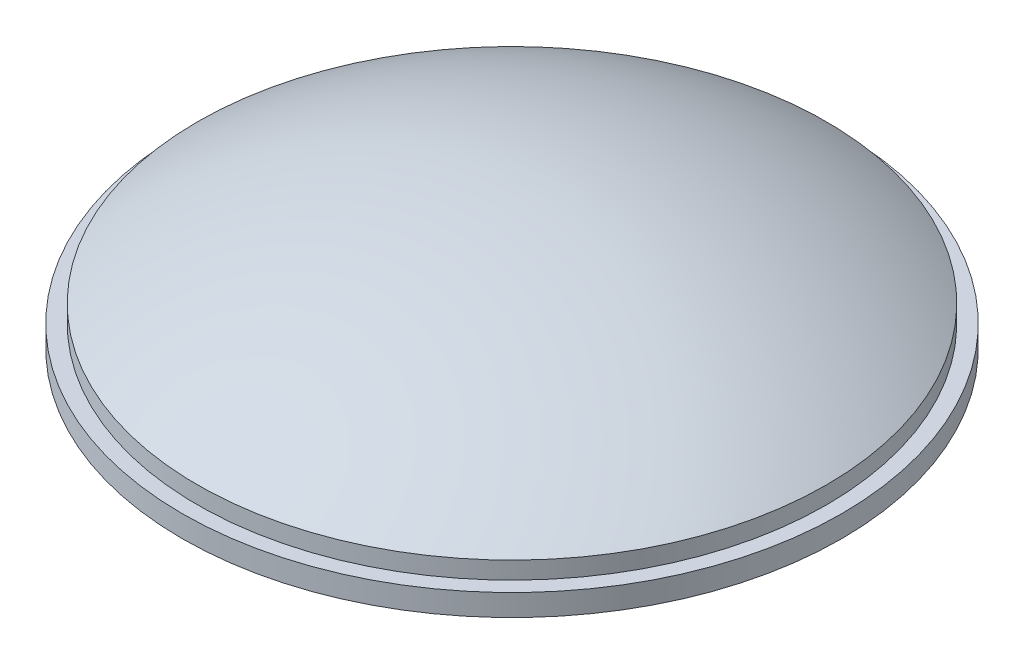
ISO-10303-21;
HEADER;
FILE_DESCRIPTION(('STEP AP214'),'2;1');
FILE_NAME('part.step','',(''),(''),'','','');
FILE_SCHEMA(('AUTOMOTIVE_DESIGN { 1 0 10303 214 1 1 1 1 }'));
ENDSEC;
DATA;
#1=APPLICATION_CONTEXT('core data for automotive mechanical design processes');
#2=APPLICATION_PROTOCOL_DEFINITION('international standard','automotive_design',2000,#1);
#3=PRODUCT_CONTEXT('',#1,'mechanical');
#4=PRODUCT('Part','Part','',(#3));
#5=PRODUCT_RELATED_PRODUCT_CATEGORY('part','',(#4));
#6=PRODUCT_DEFINITION_FORMATION('','',#4);
#7=PRODUCT_DEFINITION_CONTEXT('part definition',#1,'design');
#8=PRODUCT_DEFINITION('design','',#6,#7);
#9=PRODUCT_DEFINITION_SHAPE('','',#8);
#10=(LENGTH_UNIT() NAMED_UNIT(*) SI_UNIT(.MILLI.,.METRE.));
#11=(NAMED_UNIT(*) PLANE_ANGLE_UNIT() SI_UNIT($,.RADIAN.));
#12=(NAMED_UNIT(*) SI_UNIT($,.STERADIAN.) SOLID_ANGLE_UNIT());
#13=UNCERTAINTY_MEASURE_WITH_UNIT(LENGTH_MEASURE(1.E-05),#10,'distance_accuracy_value','');
#14=(GEOMETRIC_REPRESENTATION_CONTEXT(3) GLOBAL_UNCERTAINTY_ASSIGNED_CONTEXT((#13)) GLOBAL_UNIT_ASSIGNED_CONTEXT((#10,
#11,#12)) REPRESENTATION_CONTEXT('',''));
#15=CARTESIAN_POINT('',(0.,0.,0.));
#16=DIRECTION('',(0.,0.,1.));
#17=DIRECTION('',(1.,0.,0.));
#18=AXIS2_PLACEMENT_3D('',#15,#16,#17);
#19=CARTESIAN_POINT('',(0.,-67.2840090090088,0.));
#20=DIRECTION('',(0.,1.,0.));
#21=DIRECTION('',(1.,0.,0.));
#22=AXIS2_PLACEMENT_3D('',#19,#20,#21);
#23=SPHERICAL_SURFACE('',#22,129.484009009009);
#24=CARTESIAN_POINT('',(0.,40.,0.));
#25=DIRECTION('',(0.,1.,0.));
#26=DIRECTION('',(-1.,0.,0.));
#27=AXIS2_PLACEMENT_3D('',#24,#25,#26);
#28=CIRCLE('',#27,72.5);
#29=CARTESIAN_POINT('',(-72.5,40.,0.));
#30=VERTEX_POINT('',#29);
#31=EDGE_CURVE('E47',#30,#30,#28,.T.);
#32=ORIENTED_EDGE('',*,*,#31,.T.);
#33=EDGE_LOOP('',(#32));
#34=FACE_BOUND('',#33,.T.);
#35=ADVANCED_FACE('F35',(#34),#23,.T.);
#36=CARTESIAN_POINT('',(0.,0.,0.));
#37=DIRECTION('',(0.,1.,0.));
#38=DIRECTION('',(-1.,0.,0.));
#39=AXIS2_PLACEMENT_3D('',#36,#37,#38);
#40=CYLINDRICAL_SURFACE('',#39,72.5);
#41=ORIENTED_EDGE('',*,*,#31,.F.);
#42=EDGE_LOOP('',(#41));
#43=FACE_BOUND('',#42,.T.);
#44=CARTESIAN_POINT('',(0.,36.,0.));
#45=DIRECTION('',(0.,1.,0.));
#46=DIRECTION('',(-1.,0.,0.));
#47=AXIS2_PLACEMENT_3D('',#44,#45,#46);
#48=CIRCLE('',#47,72.5);
#49=CARTESIAN_POINT('',(-72.5,36.,0.));
#50=VERTEX_POINT('',#49);
#51=EDGE_CURVE('E82',#50,#50,#48,.T.);
#52=ORIENTED_EDGE('',*,*,#51,.T.);
#53=EDGE_LOOP('',(#52));
#54=FACE_BOUND('',#53,.T.);
#55=ADVANCED_FACE('F88',(#43,#54),#40,.T.);
#56=CARTESIAN_POINT('',(72.5,36.,0.));
#57=DIRECTION('',(0.,-1.,0.));
#58=DIRECTION('',(1.,0.,0.));
#59=AXIS2_PLACEMENT_3D('',#56,#57,#58);
#60=PLANE('',#59);
#61=ORIENTED_EDGE('',*,*,#51,.F.);
#62=EDGE_LOOP('',(#61));
#63=FACE_BOUND('',#62,.T.);
#64=CARTESIAN_POINT('',(0.,36.,0.));
#65=DIRECTION('',(0.,1.,0.));
#66=DIRECTION('',(-1.,0.,0.));
#67=AXIS2_PLACEMENT_3D('',#64,#65,#66);
#68=CIRCLE('',#67,76.);
#69=CARTESIAN_POINT('',(-76.,36.,0.));
#70=VERTEX_POINT('',#69);
#71=EDGE_CURVE('E79',#70,#70,#68,.T.);
#72=ORIENTED_EDGE('',*,*,#71,.T.);
#73=EDGE_LOOP('',(#72));
#74=FACE_BOUND('',#73,.T.);
#75=ADVANCED_FACE('F91',(#63,#74),#60,.F.);
#76=CARTESIAN_POINT('',(0.,0.,0.));
#77=DIRECTION('',(0.,1.,0.));
#78=DIRECTION('',(-1.,0.,0.));
#79=AXIS2_PLACEMENT_3D('',#76,#77,#78);
#80=CYLINDRICAL_SURFACE('',#79,76.);
#81=ORIENTED_EDGE('',*,*,#71,.F.);
#82=EDGE_LOOP('',(#81));
#83=FACE_BOUND('',#82,.T.);
#84=CARTESIAN_POINT('',(0.,31.,0.));
#85=DIRECTION('',(0.,1.,0.));
#86=DIRECTION('',(-1.,0.,0.));
#87=AXIS2_PLACEMENT_3D('',#84,#85,#86);
#88=CIRCLE('',#87,76.);
#89=CARTESIAN_POINT('',(-76.,31.,0.));
#90=VERTEX_POINT('',#89);
#91=EDGE_CURVE('E76',#90,#90,#88,.T.);
#92=ORIENTED_EDGE('',*,*,#91,.T.);
#93=EDGE_LOOP('',(#92));
#94=FACE_BOUND('',#93,.T.);
#95=ADVANCED_FACE('F96',(#83,#94),#80,.T.);
#96=CARTESIAN_POINT('',(76.,31.,0.));
#97=DIRECTION('',(0.,1.,0.));
#98=DIRECTION('',(-1.,0.,0.));
#99=AXIS2_PLACEMENT_3D('',#96,#97,#98);
#100=PLANE('',#99);
#101=ORIENTED_EDGE('',*,*,#91,.F.);
#102=EDGE_LOOP('',(#101));
#103=FACE_BOUND('',#102,.T.);
#104=CARTESIAN_POINT('',(0.,31.,0.));
#105=DIRECTION('',(0.,1.,0.));
#106=DIRECTION('',(-1.,0.,0.));
#107=AXIS2_PLACEMENT_3D('',#104,#105,#106);
#108=CIRCLE('',#107,73.);
#109=CARTESIAN_POINT('',(-73.,31.,0.));
#110=VERTEX_POINT('',#109);
#111=EDGE_CURVE('E69',#110,#110,#108,.T.);
#112=ORIENTED_EDGE('',*,*,#111,.T.);
#113=EDGE_LOOP('',(#112));
#114=FACE_BOUND('',#113,.T.);
#115=ADVANCED_FACE('F102',(#103,#114),#100,.F.);
#116=CARTESIAN_POINT('',(0.,25.,0.));
#117=DIRECTION('',(0.,1.,0.));
#118=DIRECTION('',(-1.,0.,0.));
#119=AXIS2_PLACEMENT_3D('',#116,#117,#118);
#120=CONICAL_SURFACE('',#119,67.,0.785398163397447);
#121=ORIENTED_EDGE('',*,*,#111,.F.);
#122=EDGE_LOOP('',(#121));
#123=FACE_BOUND('',#122,.T.);
#124=CARTESIAN_POINT('',(0.,25.,0.));
#125=DIRECTION('',(0.,1.,0.));
#126=DIRECTION('',(-1.,0.,0.));
#127=AXIS2_PLACEMENT_3D('',#124,#125,#126);
#128=CIRCLE('',#127,67.);
#129=CARTESIAN_POINT('',(-67.,25.,0.));
#130=VERTEX_POINT('',#129);
#131=EDGE_CURVE('E66',#130,#130,#128,.T.);
#132=ORIENTED_EDGE('',*,*,#131,.T.);
#133=EDGE_LOOP('',(#132));
#134=FACE_BOUND('',#133,.T.);
#135=ADVANCED_FACE('F108',(#123,#134),#120,.T.);
#136=CARTESIAN_POINT('',(67.,25.,0.));
#137=DIRECTION('',(0.,1.,0.));
#138=DIRECTION('',(-1.,0.,0.));
#139=AXIS2_PLACEMENT_3D('',#136,#137,#138);
#140=PLANE('',#139);
#141=DIRECTION('',(0.,0.,-1.));
#142=VECTOR('',#141,1.);
#143=CARTESIAN_POINT('',(30.,25.,-90.));
#144=LINE('',#143,#142);
#145=CARTESIAN_POINT('',(30.,25.,41.2431812546026));
#146=VERTEX_POINT('',#145);
#147=CARTESIAN_POINT('',(30.,25.,-41.2431812546026));
#148=VERTEX_POINT('',#147);
#149=EDGE_CURVE('E53',#146,#148,#144,.T.);
#150=ORIENTED_EDGE('',*,*,#149,.T.);
#151=CARTESIAN_POINT('',(0.,25.,0.));
#152=DIRECTION('',(0.,1.,0.));
#153=DIRECTION('',(-1.,0.,0.));
#154=AXIS2_PLACEMENT_3D('',#151,#152,#153);
#155=CIRCLE('',#154,51.);
#156=EDGE_CURVE('E61',#148,#146,#155,.T.);
#157=ORIENTED_EDGE('',*,*,#156,.T.);
#158=EDGE_LOOP('',(#150,#157));
#159=FACE_BOUND('',#158,.T.);
#160=ORIENTED_EDGE('',*,*,#131,.F.);
#161=EDGE_LOOP('',(#160));
#162=FACE_BOUND('',#161,.T.);
#163=ADVANCED_FACE('F59',(#159,#162),#140,.F.);
#164=CARTESIAN_POINT('',(0.,0.,0.));
#165=DIRECTION('',(0.,1.,0.));
#166=DIRECTION('',(-1.,0.,0.));
#167=AXIS2_PLACEMENT_3D('',#164,#165,#166);
#168=CONICAL_SURFACE('',#167,26.0000000000001,0.785398163397446);
#169=ORIENTED_EDGE('',*,*,#156,.F.);
#170=CARTESIAN_POINT('',(30.,63.2561842555022,-84.0634666656815));
#171=CARTESIAN_POINT('',(30.,62.4253662944433,-83.1813231893325));
#172=CARTESIAN_POINT('',(30.,61.5953262020832,-82.2984470804804));
#173=CARTESIAN_POINT('',(30.,59.9369637629694,-80.5310823683127));
#174=CARTESIAN_POINT('',(30.,59.1086414170306,-79.6465937642325));
#175=CARTESIAN_POINT('',(30.,56.6264584983327,-76.9904503549921));
#176=CARTESIAN_POINT('',(30.,54.975418905701,-75.2161570626856));
#177=CARTESIAN_POINT('',(30.,51.6809414756593,-71.6573963460739));
#178=CARTESIAN_POINT('',(30.,50.0375123205133,-69.8729208763314));
#179=CARTESIAN_POINT('',(30.,47.5809205263487,-67.1884035107763));
#180=CARTESIAN_POINT('',(30.,46.7634867778871,-66.2922690744976));
#181=CARTESIAN_POINT('',(30.,45.1318082494673,-64.4970880269588));
#182=CARTESIAN_POINT('',(30.,44.3175634939864,-63.5980413934424));
#183=CARTESIAN_POINT('',(30.,42.6752942444332,-61.7774529071672));
#184=CARTESIAN_POINT('',(30.,41.8473473240518,-60.8558410569404));
#185=CARTESIAN_POINT('',(30.,40.1956969358118,-59.0088231041535));
#186=CARTESIAN_POINT('',(30.,39.3719934633595,-58.0834170057026));
#187=CARTESIAN_POINT('',(30.,37.7294248741186,-56.228333120142));
#188=CARTESIAN_POINT('',(30.,36.9105597155701,-55.2986553700247));
#189=CARTESIAN_POINT('',(30.,35.2783662696471,-53.434455214387));
#190=CARTESIAN_POINT('',(30.,34.4650379630279,-52.4999328257252));
#191=CARTESIAN_POINT('',(30.,32.8451055225429,-50.6257688133558));
#192=CARTESIAN_POINT('',(30.,32.0384986765545,-49.6861295353528));
#193=CARTESIAN_POINT('',(30.,30.4326818474902,-47.800542223249));
#194=CARTESIAN_POINT('',(30.,29.6334718844283,-46.8545941720901));
#195=CARTESIAN_POINT('',(30.,28.0437461807804,-44.9554933048257));
#196=CARTESIAN_POINT('',(30.,27.2532300140013,-44.0023408457994));
#197=CARTESIAN_POINT('',(30.,25.6824121596366,-42.0876643719704));
#198=CARTESIAN_POINT('',(30.,24.9021103459941,-41.1261404607251));
#199=CARTESIAN_POINT('',(30.,23.4403916543385,-39.3016030462632));
#200=CARTESIAN_POINT('',(30.,22.7576893848367,-38.4396202204148));
#201=CARTESIAN_POINT('',(30.,21.4035675161649,-36.7068190085001));
#202=CARTESIAN_POINT('',(30.,20.7321479620497,-35.8360005871733));
#203=CARTESIAN_POINT('',(30.,19.4024250217844,-34.0838073290471));
#204=CARTESIAN_POINT('',(30.,18.7441273174398,-33.2024281729909));
#205=CARTESIAN_POINT('',(30.,17.4436066745168,-31.4278776180563));
#206=CARTESIAN_POINT('',(30.,16.8013835624419,-30.5347063466119));
#207=CARTESIAN_POINT('',(30.,15.5384121728091,-28.7375565434823));
#208=CARTESIAN_POINT('',(30.,14.9176015216905,-27.8336219606618));
#209=CARTESIAN_POINT('',(30.,13.699535442564,-26.0098806403375));
#210=CARTESIAN_POINT('',(30.,13.1022814352392,-25.090072950333));
#211=CARTESIAN_POINT('',(30.,11.9372828893454,-23.232742276029));
#212=CARTESIAN_POINT('',(30.,11.3695190444053,-22.2952314440102));
#213=CARTESIAN_POINT('',(30.,10.2702550833446,-20.3992217502899));
#214=CARTESIAN_POINT('',(30.,9.73874847316151,-19.4407266879305));
#215=CARTESIAN_POINT('',(30.,8.98497271763045,-18.0029525843828));
#216=CARTESIAN_POINT('',(30.,8.74522330985191,-17.5328157701222));
#217=CARTESIAN_POINT('',(30.,8.2775420175087,-16.586711387152));
#218=CARTESIAN_POINT('',(30.,8.04960995522943,-16.1107439062599));
#219=CARTESIAN_POINT('',(30.,7.38550812961494,-14.6736081512883));
#220=CARTESIAN_POINT('',(30.,6.96903012965642,-13.703201668415));
#221=CARTESIAN_POINT('',(30.,6.20206946369811,-11.738343673811));
#222=CARTESIAN_POINT('',(30.,5.85146374721712,-10.7439409905584));
#223=CARTESIAN_POINT('',(30.,5.385314399514,-9.234024830697));
#224=CARTESIAN_POINT('',(30.,5.23988902149167,-8.72765790341996));
#225=CARTESIAN_POINT('',(30.,4.97080370192731,-7.70919973912899));
#226=CARTESIAN_POINT('',(30.,4.84714064580353,-7.19710933242343));
#227=CARTESIAN_POINT('',(30.,4.64151115068319,-6.25134533046255));
#228=CARTESIAN_POINT('',(30.,4.55603480673082,-5.81843315536391));
#229=CARTESIAN_POINT('',(30.,4.40255507614627,-4.94956018228016));
#230=CARTESIAN_POINT('',(30.,4.33454959692239,-4.51359975583407));
#231=CARTESIAN_POINT('',(30.,4.2168240726839,-3.63924350859239));
#232=CARTESIAN_POINT('',(30.,4.1671026242438,-3.20084787733873));
#233=CARTESIAN_POINT('',(30.,4.08657207646532,-2.32231380224259));
#234=CARTESIAN_POINT('',(30.,4.05576307281358,-1.88217534959373));
#235=CARTESIAN_POINT('',(30.,4.01351700861687,-1.00199013985662));
#236=CARTESIAN_POINT('',(30.,4.00203515972078,-0.561945540179196));
#237=CARTESIAN_POINT('',(30.,3.99845986422236,0.318217991001513));
#238=CARTESIAN_POINT('',(30.,4.00636622370707,0.758336921717343));
#239=CARTESIAN_POINT('',(30.,4.04146244378115,1.63785332225908));
#240=CARTESIAN_POINT('',(30.,4.06865446789292,2.07725070559592));
#241=CARTESIAN_POINT('',(30.,4.14196104661393,2.95447073337908));
#242=CARTESIAN_POINT('',(30.,4.18807639933009,3.39229331062091));
#243=CARTESIAN_POINT('',(30.,4.31122289495557,4.36495416348759));
#244=CARTESIAN_POINT('',(30.,4.39290019204345,4.89920788161711));
#245=CARTESIAN_POINT('',(30.,4.58241236252349,5.96305436617669));
#246=CARTESIAN_POINT('',(30.,4.69024885153248,6.49264684262966));
#247=CARTESIAN_POINT('',(30.,4.93031982808335,7.54638747010486));
#248=CARTESIAN_POINT('',(30.,5.06256037056842,8.07053423581354));
#249=CARTESIAN_POINT('',(30.,5.34947354261337,9.1126545598085));
#250=CARTESIAN_POINT('',(30.,5.50414739193951,9.63062778076227));
#251=CARTESIAN_POINT('',(30.,5.83493495987267,10.6631979474077));
#252=CARTESIAN_POINT('',(30.,6.01117558636112,11.1777540862603));
#253=CARTESIAN_POINT('',(30.,6.38232301215375,12.2000700588485));
#254=CARTESIAN_POINT('',(30.,6.57722997394899,12.7078298333775));
#255=CARTESIAN_POINT('',(30.,6.98374686389606,13.7164333337717));
#256=CARTESIAN_POINT('',(30.,7.19535205165672,14.2172789753617));
#257=CARTESIAN_POINT('',(30.,7.63354587209392,15.2123251290182));
#258=CARTESIAN_POINT('',(30.,7.86013402046011,15.7065258552547));
#259=CARTESIAN_POINT('',(30.,8.55201069308329,17.1628597330158));
#260=CARTESIAN_POINT('',(30.,9.03646911208396,18.1159163015423));
#261=CARTESIAN_POINT('',(30.,10.04672966342,19.9999747173323));
#262=CARTESIAN_POINT('',(30.,10.5725437935651,20.930970061664));
#263=CARTESIAN_POINT('',(30.,11.6578876564405,22.7743723311027));
#264=CARTESIAN_POINT('',(30.,12.2174532827932,23.6867580353083));
#265=CARTESIAN_POINT('',(30.,13.3633595946569,25.4943615816247));
#266=CARTESIAN_POINT('',(30.,13.9496977998924,26.3895810031937));
#267=CARTESIAN_POINT('',(30.,15.1466366478178,28.1687865192262));
#268=CARTESIAN_POINT('',(30.,15.7573245919997,29.0527137011548));
#269=CARTESIAN_POINT('',(30.,16.9968651904574,30.8077297125316));
#270=CARTESIAN_POINT('',(30.,17.6257181847127,31.6788183012297));
#271=CARTESIAN_POINT('',(30.,18.8981545159248,33.409399053344));
#272=CARTESIAN_POINT('',(30.,19.5417294465792,34.268897410122));
#273=CARTESIAN_POINT('',(30.,20.8415124567003,35.9782618531779));
#274=CARTESIAN_POINT('',(30.,21.4977204397039,36.8281280129264));
#275=CARTESIAN_POINT('',(30.,22.8314578845211,38.5330733227064));
#276=CARTESIAN_POINT('',(30.,23.5091605195286,39.3880168294231));
#277=CARTESIAN_POINT('',(30.,24.8739574594678,41.0903676920497));
#278=CARTESIAN_POINT('',(30.,25.5610517771835,41.9377750376989));
#279=CARTESIAN_POINT('',(30.,26.9433660881821,43.6260803788503));
#280=CARTESIAN_POINT('',(30.,27.6385869360934,44.4669776739789));
#281=CARTESIAN_POINT('',(30.,29.0359867457392,46.1429719172708));
#282=CARTESIAN_POINT('',(30.,29.7381657348963,46.9780688425523));
#283=CARTESIAN_POINT('',(30.,31.1467335825323,48.6409695095796));
#284=CARTESIAN_POINT('',(30.,31.8531067144065,49.468786581169));
#285=CARTESIAN_POINT('',(30.,33.2711158814724,51.1198982630518));
#286=CARTESIAN_POINT('',(30.,33.982751916298,51.9431928736599));
#287=CARTESIAN_POINT('',(30.,35.4106190416706,53.5857155493524));
#288=CARTESIAN_POINT('',(30.,36.1268499063856,54.4049438108368));
#289=CARTESIAN_POINT('',(30.,37.5634079962696,56.0397977192166));
#290=CARTESIAN_POINT('',(30.,38.2837352183895,56.8554233687927));
#291=CARTESIAN_POINT('',(30.,40.4439632638287,59.2904806257557));
#292=CARTESIAN_POINT('',(30.,41.8892487636336,60.905137088485));
#293=CARTESIAN_POINT('',(30.,44.7913345091569,64.1240762053625));
#294=CARTESIAN_POINT('',(30.,46.2481348482179,65.7283587752248));
#295=CARTESIAN_POINT('',(30.,49.1711475239336,68.928407913698));
#296=CARTESIAN_POINT('',(30.,50.6373601352535,70.5241742312795));
#297=CARTESIAN_POINT('',(30.,53.5775040392454,73.7085675060198));
#298=CARTESIAN_POINT('',(30.,55.0514353107898,75.2971944826984));
#299=CARTESIAN_POINT('',(30.,58.0059167066772,78.4686321986462));
#300=CARTESIAN_POINT('',(30.,59.4864675978941,80.051442223185));
#301=CARTESIAN_POINT('',(30.,62.4530025353775,83.2119623420858));
#302=CARTESIAN_POINT('',(30.,63.9389865847638,84.7896724335184));
#303=CARTESIAN_POINT('',(30.,66.9155514391016,87.9407014904706));
#304=CARTESIAN_POINT('',(30.,68.4061321702108,89.5140205257637));
#305=CARTESIAN_POINT('',(30.,71.3912623603236,92.6568897445123));
#306=CARTESIAN_POINT('',(30.,72.8858118218337,94.2264399255862));
#307=CARTESIAN_POINT('',(30.,77.3789638458133,98.93479622311));
#308=CARTESIAN_POINT('',(30.,80.382707562857,102.068696592502));
#309=CARTESIAN_POINT('',(30.,86.4006049344509,108.3264978091));
#310=CARTESIAN_POINT('',(30.,89.4147586238402,111.450398622773));
#311=CARTESIAN_POINT('',(30.,95.4509928042615,117.690135110644));
#312=CARTESIAN_POINT('',(30.,98.4730727646375,120.805971298343));
#313=CARTESIAN_POINT('',(30.,104.523683211303,127.031365594737));
#314=CARTESIAN_POINT('',(30.,107.552213690585,130.140923710244));
#315=CARTESIAN_POINT('',(30.,113.332864887173,136.066270460748));
#316=CARTESIAN_POINT('',(30.,116.084523293172,138.882510227269));
#317=CARTESIAN_POINT('',(30.,121.591425434126,144.511482777275));
#318=CARTESIAN_POINT('',(30.,124.346669169764,147.324215560093));
#319=CARTESIAN_POINT('',(30.,129.860233013358,152.946773622857));
#320=CARTESIAN_POINT('',(30.,132.618553181367,155.756598843907));
#321=CARTESIAN_POINT('',(30.,138.137764929051,161.373722759363));
#322=CARTESIAN_POINT('',(30.,140.898656508865,164.181021453634));
#323=CARTESIAN_POINT('',(30.,146.417806004604,169.788530651883));
#324=CARTESIAN_POINT('',(30.,149.176060058951,172.588744956892));
#325=CARTESIAN_POINT('',(30.,154.694469235742,178.187299864422));
#326=CARTESIAN_POINT('',(30.,157.454624358276,180.985640466854));
#327=CARTESIAN_POINT('',(30.,162.976525618381,186.580627671909));
#328=CARTESIAN_POINT('',(30.,165.738271718942,189.377274311061));
#329=CARTESIAN_POINT('',(30.,171.263217720436,194.969130363231));
#330=CARTESIAN_POINT('',(30.,174.026417621142,197.764339776471));
#331=CARTESIAN_POINT('',(30.,176.790245367732,200.558928039379));
#332=B_SPLINE_CURVE_WITH_KNOTS('',3,(#170,#171,#172,#173,#174,#175,#176,#177,#178,#179,#180,
#181,#182,#183,#184,#185,#186,#187,#188,#189,#190,#191,#192,#193,#194,#195,#196,#197,#198,#199,
#200,#201,#202,#203,#204,#205,#206,#207,#208,#209,#210,#211,#212,#213,#214,#215,#216,#217,#218,
#219,#220,#221,#222,#223,#224,#225,#226,#227,#228,#229,#230,#231,#232,#233,#234,#235,#236,#237,
#238,#239,#240,#241,#242,#243,#244,#245,#246,#247,#248,#249,#250,#251,#252,#253,#254,#255,#256,
#257,#258,#259,#260,#261,#262,#263,#264,#265,#266,#267,#268,#269,#270,#271,#272,#273,#274,#275,
#276,#277,#278,#279,#280,#281,#282,#283,#284,#285,#286,#287,#288,#289,#290,#291,#292,#293,#294,
#295,#296,#297,#298,#299,#300,#301,#302,#303,#304,#305,#306,#307,#308,#309,#310,#311,#312,#313,
#314,#315,#316,#317,#318,#319,#320,#321,#322,#323,#324,#325,#326,#327,#328,#329,#330,#331),
.UNSPECIFIED.,.F.,.F.,(4,2,2,2,2,2,2,2,2,2,2,2,2,2,2,2,2,2,2,2,2,2,2,2,2,2,2,2,2,2,2,2,2,2,2,2,
2,2,2,2,2,2,2,2,2,2,2,2,2,2,2,2,2,2,2,2,2,2,2,2,2,2,2,2,2,2,2,2,2,2,2,2,2,2,2,2,2,2,2,2,4),(0.,
3.63537005892826,7.27074184206401,14.5416466362331,21.8194388303889,25.4582914325571,
29.0971719101816,32.81384986065,36.5305237870024,40.2471655874976,43.9637944632818,
47.6788429977365,51.3939015811969,55.1087772233963,58.8236069765156,62.1222967560164,
65.4209997048773,68.7211012664621,72.0211671939405,75.3106290919999,78.6002890725916,
81.8877675357904,85.1746556215842,86.7577280580929,88.3407766807293,91.5068573180921,
94.6669635481228,96.2470750116931,97.826960148505,99.1504416818317,100.473764619742,
101.796985962276,103.120213999531,104.440371372238,105.760515541321,107.080807831479,
108.401155811772,110.02182576422,111.642595836296,113.263768583167,114.885029511138,
116.516336140929,118.147656972588,119.778516349854,121.409323036843,124.615264302945,
127.822139108003,131.032486598819,134.242537276473,137.465368022384,140.688259126362,
143.909353743229,147.130423774322,150.40324801526,153.676076711638,156.94925274912,
160.222441691569,163.487106102256,166.751770285834,170.016275224798,173.280777734147,
179.781752815928,186.282780650619,192.783999066086,199.285199695679,205.787174074749,
212.289152187929,218.791026390322,225.292904700253,238.315705164388,251.338549254292,
264.360542665931,277.382521940757,289.194608418965,301.006697143846,312.819020630232,
324.631344753927,336.42297169091,348.214599191531,360.005962658737,371.797324300771),.UNSPECIFIED.);
#333=EDGE_CURVE('E11',#148,#146,#332,.T.);
#334=ORIENTED_EDGE('',*,*,#333,.T.);
#335=EDGE_LOOP('',(#169,#334));
#336=FACE_BOUND('',#335,.T.);
#337=CARTESIAN_POINT('',(0.,0.,0.));
#338=DIRECTION('',(0.,1.,0.));
#339=DIRECTION('',(-1.,0.,0.));
#340=AXIS2_PLACEMENT_3D('',#337,#338,#339);
#341=CIRCLE('',#340,26.0000000000001);
#342=CARTESIAN_POINT('',(-26.0000000000001,0.,0.));
#343=VERTEX_POINT('',#342);
#344=EDGE_CURVE('E62',#343,#343,#341,.T.);
#345=ORIENTED_EDGE('',*,*,#344,.T.);
#346=EDGE_LOOP('',(#345));
#347=FACE_BOUND('',#346,.T.);
#348=ADVANCED_FACE('F64',(#336,#347),#168,.T.);
#349=CARTESIAN_POINT('',(26.0000000000001,0.,0.));
#350=DIRECTION('',(0.,1.,0.));
#351=DIRECTION('',(-1.,0.,0.));
#352=AXIS2_PLACEMENT_3D('',#349,#350,#351);
#353=PLANE('',#352);
#354=ORIENTED_EDGE('',*,*,#344,.F.);
#355=EDGE_LOOP('',(#354));
#356=FACE_BOUND('',#355,.T.);
#357=ADVANCED_FACE('F121',(#356),#353,.F.);
#358=CARTESIAN_POINT('',(30.,218.13207915828,-90.));
#359=DIRECTION('',(-1.,0.,0.));
#360=DIRECTION('',(0.,-1.,0.));
#361=AXIS2_PLACEMENT_3D('',#358,#359,#360);
#362=PLANE('',#361);
#363=ORIENTED_EDGE('',*,*,#149,.F.);
#364=ORIENTED_EDGE('',*,*,#333,.F.);
#365=EDGE_LOOP('',(#363,#364));
#366=FACE_BOUND('',#365,.T.);
#367=ADVANCED_FACE('F54',(#366),#362,.F.);
#368=CLOSED_SHELL('',(#35,#55,#75,#95,#115,#135,#163,#348,#357,#367));
#369=MANIFOLD_SOLID_BREP('B2',#368);
#370=ADVANCED_BREP_SHAPE_REPRESENTATION('',(#18,#369),#14);
#371=SHAPE_DEFINITION_REPRESENTATION(#9,#370);
ENDSEC;
END-ISO-10303-21;
